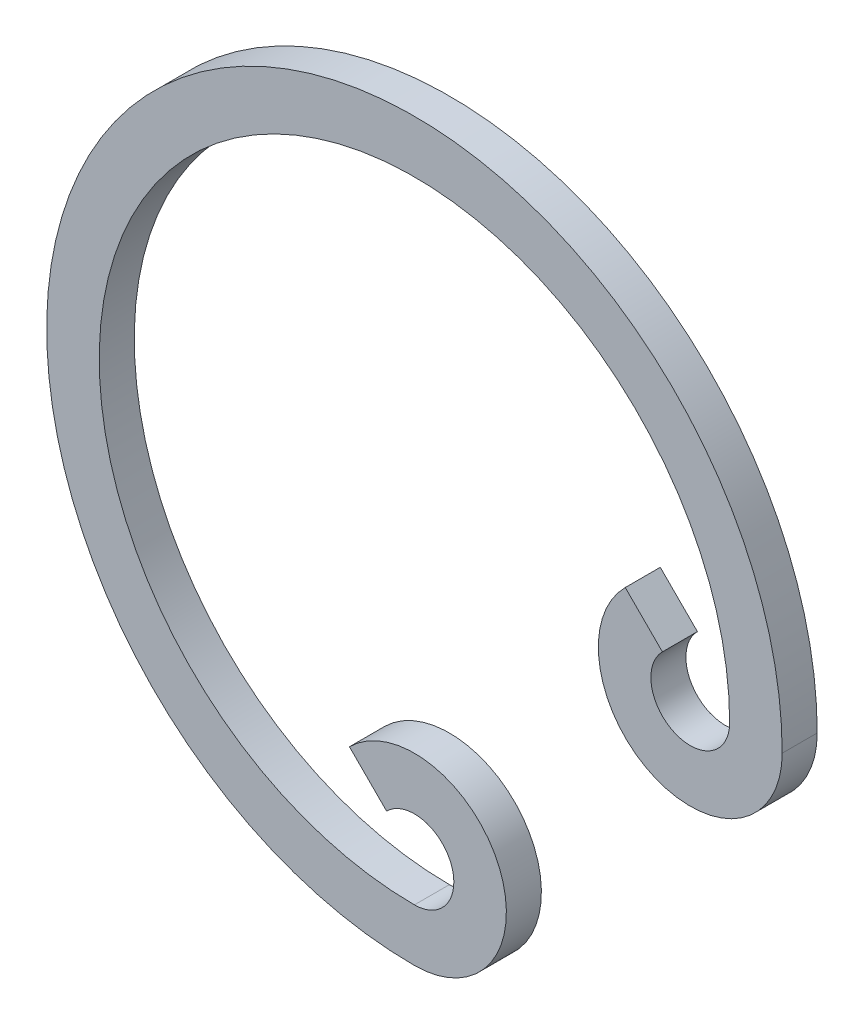
ISO-10303-21;
HEADER;
FILE_DESCRIPTION(('STEP AP214'),'2;1');
FILE_NAME('part.step','',(''),(''),'','','');
FILE_SCHEMA(('AUTOMOTIVE_DESIGN { 1 0 10303 214 1 1 1 1 }'));
ENDSEC;
DATA;
#1=APPLICATION_CONTEXT('core data for automotive mechanical design processes');
#2=APPLICATION_PROTOCOL_DEFINITION('international standard','automotive_design',2000,#1);
#3=PRODUCT_CONTEXT('',#1,'mechanical');
#4=PRODUCT('Part','Part','',(#3));
#5=PRODUCT_RELATED_PRODUCT_CATEGORY('part','',(#4));
#6=PRODUCT_DEFINITION_FORMATION('','',#4);
#7=PRODUCT_DEFINITION_CONTEXT('part definition',#1,'design');
#8=PRODUCT_DEFINITION('design','',#6,#7);
#9=PRODUCT_DEFINITION_SHAPE('','',#8);
#10=(LENGTH_UNIT() NAMED_UNIT(*) SI_UNIT(.MILLI.,.METRE.));
#11=(NAMED_UNIT(*) PLANE_ANGLE_UNIT() SI_UNIT($,.RADIAN.));
#12=(NAMED_UNIT(*) SI_UNIT($,.STERADIAN.) SOLID_ANGLE_UNIT());
#13=UNCERTAINTY_MEASURE_WITH_UNIT(LENGTH_MEASURE(1.E-05),#10,'distance_accuracy_value','');
#14=(GEOMETRIC_REPRESENTATION_CONTEXT(3) GLOBAL_UNCERTAINTY_ASSIGNED_CONTEXT((#13)) GLOBAL_UNIT_ASSIGNED_CONTEXT((#10,
#11,#12)) REPRESENTATION_CONTEXT('',''));
#15=CARTESIAN_POINT('',(0.,0.,0.));
#16=DIRECTION('',(0.,0.,1.));
#17=DIRECTION('',(1.,0.,0.));
#18=AXIS2_PLACEMENT_3D('',#15,#16,#17);
#19=CARTESIAN_POINT('',(0.,0.,1.));
#20=DIRECTION('',(0.,0.,-1.));
#21=DIRECTION('',(-1.,0.,0.));
#22=AXIS2_PLACEMENT_3D('',#19,#20,#21);
#23=CYLINDRICAL_SURFACE('',#22,10.5);
#24=CARTESIAN_POINT('',(0.,0.,0.));
#25=DIRECTION('',(0.,0.,1.));
#26=DIRECTION('',(1.,0.,0.));
#27=AXIS2_PLACEMENT_3D('',#24,#25,#26);
#28=CIRCLE('',#27,10.5);
#29=CARTESIAN_POINT('',(10.5,0.,0.));
#30=VERTEX_POINT('',#29);
#31=CARTESIAN_POINT('',(0.,-10.5,0.));
#32=VERTEX_POINT('',#31);
#33=EDGE_CURVE('E125',#30,#32,#28,.T.);
#34=ORIENTED_EDGE('',*,*,#33,.T.);
#35=DIRECTION('',(0.,0.,-1.));
#36=VECTOR('',#35,1.);
#37=CARTESIAN_POINT('',(0.,-10.5,1.));
#38=LINE('',#37,#36);
#39=CARTESIAN_POINT('',(0.,-10.5,1.));
#40=VERTEX_POINT('',#39);
#41=EDGE_CURVE('E11',#40,#32,#38,.T.);
#42=ORIENTED_EDGE('',*,*,#41,.F.);
#43=CARTESIAN_POINT('',(0.,0.,1.));
#44=DIRECTION('',(0.,0.,1.));
#45=DIRECTION('',(1.,0.,0.));
#46=AXIS2_PLACEMENT_3D('',#43,#44,#45);
#47=CIRCLE('',#46,10.5);
#48=CARTESIAN_POINT('',(10.5,0.,1.));
#49=VERTEX_POINT('',#48);
#50=EDGE_CURVE('E150',#49,#40,#47,.T.);
#51=ORIENTED_EDGE('',*,*,#50,.F.);
#52=DIRECTION('',(0.,0.,-1.));
#53=VECTOR('',#52,1.);
#54=CARTESIAN_POINT('',(10.5,0.,1.));
#55=LINE('',#54,#53);
#56=EDGE_CURVE('E140',#49,#30,#55,.T.);
#57=ORIENTED_EDGE('',*,*,#56,.T.);
#58=EDGE_LOOP('',(#34,#42,#51,#57));
#59=FACE_BOUND('',#58,.T.);
#60=ADVANCED_FACE('F34',(#59),#23,.T.);
#61=CARTESIAN_POINT('',(0.,-7.875,1.));
#62=DIRECTION('',(0.,0.,-1.));
#63=DIRECTION('',(-1.,0.,0.));
#64=AXIS2_PLACEMENT_3D('',#61,#62,#63);
#65=CYLINDRICAL_SURFACE('',#64,2.625);
#66=CARTESIAN_POINT('',(0.,-7.875,0.));
#67=DIRECTION('',(0.,0.,1.));
#68=DIRECTION('',(1.,0.,0.));
#69=AXIS2_PLACEMENT_3D('',#66,#67,#68);
#70=CIRCLE('',#69,2.625);
#71=CARTESIAN_POINT('',(-1.85615530061469,-6.01884469938531,0.));
#72=VERTEX_POINT('',#71);
#73=EDGE_CURVE('E158',#32,#72,#70,.T.);
#74=ORIENTED_EDGE('',*,*,#73,.T.);
#75=DIRECTION('',(0.,0.,-1.));
#76=VECTOR('',#75,1.);
#77=CARTESIAN_POINT('',(-1.85615530061469,-6.01884469938531,1.));
#78=LINE('',#77,#76);
#79=CARTESIAN_POINT('',(-1.85615530061469,-6.01884469938531,1.));
#80=VERTEX_POINT('',#79);
#81=EDGE_CURVE('E42',#80,#72,#78,.T.);
#82=ORIENTED_EDGE('',*,*,#81,.F.);
#83=CARTESIAN_POINT('',(0.,-7.875,1.));
#84=DIRECTION('',(0.,0.,1.));
#85=DIRECTION('',(1.,0.,0.));
#86=AXIS2_PLACEMENT_3D('',#83,#84,#85);
#87=CIRCLE('',#86,2.625);
#88=EDGE_CURVE('E81',#40,#80,#87,.T.);
#89=ORIENTED_EDGE('',*,*,#88,.F.);
#90=ORIENTED_EDGE('',*,*,#41,.T.);
#91=EDGE_LOOP('',(#74,#82,#89,#90));
#92=FACE_BOUND('',#91,.T.);
#93=ADVANCED_FACE('F187',(#92),#65,.T.);
#94=CARTESIAN_POINT('',(-0.795495128834863,-7.07950487116514,1.));
#95=DIRECTION('',(0.707106781186547,0.707106781186547,0.));
#96=DIRECTION('',(-0.707106781186548,0.707106781186548,0.));
#97=AXIS2_PLACEMENT_3D('',#94,#95,#96);
#98=PLANE('',#97);
#99=DIRECTION('',(0.707106781186547,-0.707106781186547,0.));
#100=VECTOR('',#99,1.);
#101=CARTESIAN_POINT('',(-0.795495128834863,-7.07950487116514,0.));
#102=LINE('',#101,#100);
#103=CARTESIAN_POINT('',(-0.795495128834862,-7.07950487116514,0.));
#104=VERTEX_POINT('',#103);
#105=EDGE_CURVE('E68',#72,#104,#102,.T.);
#106=ORIENTED_EDGE('',*,*,#105,.T.);
#107=DIRECTION('',(0.,0.,-1.));
#108=VECTOR('',#107,1.);
#109=CARTESIAN_POINT('',(-0.795495128834862,-7.07950487116514,1.));
#110=LINE('',#109,#108);
#111=CARTESIAN_POINT('',(-0.795495128834862,-7.07950487116514,1.));
#112=VERTEX_POINT('',#111);
#113=EDGE_CURVE('E164',#112,#104,#110,.T.);
#114=ORIENTED_EDGE('',*,*,#113,.F.);
#115=DIRECTION('',(0.707106781186547,-0.707106781186547,0.));
#116=VECTOR('',#115,1.);
#117=CARTESIAN_POINT('',(-0.795495128834863,-7.07950487116514,1.));
#118=LINE('',#117,#116);
#119=EDGE_CURVE('E153',#80,#112,#118,.T.);
#120=ORIENTED_EDGE('',*,*,#119,.F.);
#121=ORIENTED_EDGE('',*,*,#81,.T.);
#122=EDGE_LOOP('',(#106,#114,#120,#121));
#123=FACE_BOUND('',#122,.T.);
#124=ADVANCED_FACE('F166',(#123),#98,.F.);
#125=CARTESIAN_POINT('',(0.,-7.875,1.));
#126=DIRECTION('',(0.,0.,-1.));
#127=DIRECTION('',(-1.,0.,0.));
#128=AXIS2_PLACEMENT_3D('',#125,#126,#127);
#129=CYLINDRICAL_SURFACE('',#128,1.125);
#130=CARTESIAN_POINT('',(0.,-7.875,0.));
#131=DIRECTION('',(0.,0.,-1.));
#132=DIRECTION('',(1.,0.,0.));
#133=AXIS2_PLACEMENT_3D('',#130,#131,#132);
#134=CIRCLE('',#133,1.125);
#135=CARTESIAN_POINT('',(0.,-9.,0.));
#136=VERTEX_POINT('',#135);
#137=EDGE_CURVE('E74',#104,#136,#134,.T.);
#138=ORIENTED_EDGE('',*,*,#137,.T.);
#139=DIRECTION('',(0.,0.,-1.));
#140=VECTOR('',#139,1.);
#141=CARTESIAN_POINT('',(0.,-9.,1.));
#142=LINE('',#141,#140);
#143=CARTESIAN_POINT('',(0.,-9.,1.));
#144=VERTEX_POINT('',#143);
#145=EDGE_CURVE('E115',#144,#136,#142,.T.);
#146=ORIENTED_EDGE('',*,*,#145,.F.);
#147=CARTESIAN_POINT('',(0.,-7.875,1.));
#148=DIRECTION('',(0.,0.,-1.));
#149=DIRECTION('',(1.,0.,0.));
#150=AXIS2_PLACEMENT_3D('',#147,#148,#149);
#151=CIRCLE('',#150,1.125);
#152=EDGE_CURVE('E50',#112,#144,#151,.T.);
#153=ORIENTED_EDGE('',*,*,#152,.F.);
#154=ORIENTED_EDGE('',*,*,#113,.T.);
#155=EDGE_LOOP('',(#138,#146,#153,#154));
#156=FACE_BOUND('',#155,.T.);
#157=ADVANCED_FACE('F179',(#156),#129,.F.);
#158=CARTESIAN_POINT('',(0.,0.,1.));
#159=DIRECTION('',(0.,0.,-1.));
#160=DIRECTION('',(-1.,0.,0.));
#161=AXIS2_PLACEMENT_3D('',#158,#159,#160);
#162=CYLINDRICAL_SURFACE('',#161,9.);
#163=CARTESIAN_POINT('',(0.,0.,0.));
#164=DIRECTION('',(0.,0.,-1.));
#165=DIRECTION('',(1.,0.,0.));
#166=AXIS2_PLACEMENT_3D('',#163,#164,#165);
#167=CIRCLE('',#166,9.);
#168=CARTESIAN_POINT('',(9.,0.,0.));
#169=VERTEX_POINT('',#168);
#170=EDGE_CURVE('E121',#136,#169,#167,.T.);
#171=ORIENTED_EDGE('',*,*,#170,.T.);
#172=DIRECTION('',(0.,0.,-1.));
#173=VECTOR('',#172,1.);
#174=CARTESIAN_POINT('',(9.,0.,1.));
#175=LINE('',#174,#173);
#176=CARTESIAN_POINT('',(9.,0.,1.));
#177=VERTEX_POINT('',#176);
#178=EDGE_CURVE('E118',#177,#169,#175,.T.);
#179=ORIENTED_EDGE('',*,*,#178,.F.);
#180=CARTESIAN_POINT('',(0.,0.,1.));
#181=DIRECTION('',(0.,0.,-1.));
#182=DIRECTION('',(1.,0.,0.));
#183=AXIS2_PLACEMENT_3D('',#180,#181,#182);
#184=CIRCLE('',#183,9.);
#185=EDGE_CURVE('E107',#144,#177,#184,.T.);
#186=ORIENTED_EDGE('',*,*,#185,.F.);
#187=ORIENTED_EDGE('',*,*,#145,.T.);
#188=EDGE_LOOP('',(#171,#179,#186,#187));
#189=FACE_BOUND('',#188,.T.);
#190=ADVANCED_FACE('F119',(#189),#162,.F.);
#191=CARTESIAN_POINT('',(0.,0.,1.));
#192=DIRECTION('',(0.,0.,1.));
#193=DIRECTION('',(1.,0.,0.));
#194=AXIS2_PLACEMENT_3D('',#191,#192,#193);
#195=PLANE('',#194);
#196=ORIENTED_EDGE('',*,*,#50,.T.);
#197=ORIENTED_EDGE('',*,*,#88,.T.);
#198=ORIENTED_EDGE('',*,*,#119,.T.);
#199=ORIENTED_EDGE('',*,*,#152,.T.);
#200=ORIENTED_EDGE('',*,*,#185,.T.);
#201=CARTESIAN_POINT('',(7.875,0.,1.));
#202=DIRECTION('',(0.,0.,1.));
#203=DIRECTION('',(0.,-1.,0.));
#204=AXIS2_PLACEMENT_3D('',#201,#202,#203);
#205=CIRCLE('',#204,1.125);
#206=CARTESIAN_POINT('',(7.07950487116514,0.795495128834867,1.));
#207=VERTEX_POINT('',#206);
#208=EDGE_CURVE('E112',#207,#177,#205,.T.);
#209=ORIENTED_EDGE('',*,*,#208,.F.);
#210=DIRECTION('',(0.707106781186548,-0.707106781186547,0.));
#211=VECTOR('',#210,1.);
#212=CARTESIAN_POINT('',(7.07950487116514,0.795495128834868,1.));
#213=LINE('',#212,#211);
#214=CARTESIAN_POINT('',(6.01884469938531,1.85615530061469,1.));
#215=VERTEX_POINT('',#214);
#216=EDGE_CURVE('E129',#215,#207,#213,.T.);
#217=ORIENTED_EDGE('',*,*,#216,.F.);
#218=CARTESIAN_POINT('',(7.875,0.,1.));
#219=DIRECTION('',(0.,0.,-1.));
#220=DIRECTION('',(0.,-1.,0.));
#221=AXIS2_PLACEMENT_3D('',#218,#219,#220);
#222=CIRCLE('',#221,2.625);
#223=EDGE_CURVE('E132',#49,#215,#222,.T.);
#224=ORIENTED_EDGE('',*,*,#223,.F.);
#225=EDGE_LOOP('',(#196,#197,#198,#199,#200,#209,#217,#224));
#226=FACE_BOUND('',#225,.T.);
#227=ADVANCED_FACE('F109',(#226),#195,.T.);
#228=CARTESIAN_POINT('',(0.,0.,0.));
#229=DIRECTION('',(0.,0.,1.));
#230=DIRECTION('',(1.,0.,0.));
#231=AXIS2_PLACEMENT_3D('',#228,#229,#230);
#232=PLANE('',#231);
#233=ORIENTED_EDGE('',*,*,#33,.F.);
#234=CARTESIAN_POINT('',(7.875,0.,0.));
#235=DIRECTION('',(0.,0.,-1.));
#236=DIRECTION('',(0.,-1.,0.));
#237=AXIS2_PLACEMENT_3D('',#234,#235,#236);
#238=CIRCLE('',#237,2.625);
#239=CARTESIAN_POINT('',(6.01884469938531,1.85615530061469,0.));
#240=VERTEX_POINT('',#239);
#241=EDGE_CURVE('E130',#30,#240,#238,.T.);
#242=ORIENTED_EDGE('',*,*,#241,.T.);
#243=DIRECTION('',(0.707106781186548,-0.707106781186547,0.));
#244=VECTOR('',#243,1.);
#245=CARTESIAN_POINT('',(7.07950487116514,0.795495128834868,0.));
#246=LINE('',#245,#244);
#247=CARTESIAN_POINT('',(7.07950487116514,0.795495128834867,0.));
#248=VERTEX_POINT('',#247);
#249=EDGE_CURVE('E135',#240,#248,#246,.T.);
#250=ORIENTED_EDGE('',*,*,#249,.T.);
#251=CARTESIAN_POINT('',(7.875,0.,0.));
#252=DIRECTION('',(0.,0.,1.));
#253=DIRECTION('',(0.,-1.,0.));
#254=AXIS2_PLACEMENT_3D('',#251,#252,#253);
#255=CIRCLE('',#254,1.125);
#256=EDGE_CURVE('E141',#248,#169,#255,.T.);
#257=ORIENTED_EDGE('',*,*,#256,.T.);
#258=ORIENTED_EDGE('',*,*,#170,.F.);
#259=ORIENTED_EDGE('',*,*,#137,.F.);
#260=ORIENTED_EDGE('',*,*,#105,.F.);
#261=ORIENTED_EDGE('',*,*,#73,.F.);
#262=EDGE_LOOP('',(#233,#242,#250,#257,#258,#259,#260,#261));
#263=FACE_BOUND('',#262,.T.);
#264=ADVANCED_FACE('F168',(#263),#232,.F.);
#265=CARTESIAN_POINT('',(7.875,0.,1.));
#266=DIRECTION('',(0.,0.,-1.));
#267=DIRECTION('',(-1.,0.,0.));
#268=AXIS2_PLACEMENT_3D('',#265,#266,#267);
#269=CYLINDRICAL_SURFACE('',#268,1.125);
#270=ORIENTED_EDGE('',*,*,#256,.F.);
#271=DIRECTION('',(0.,0.,-1.));
#272=VECTOR('',#271,1.);
#273=CARTESIAN_POINT('',(7.07950487116514,0.795495128834867,1.));
#274=LINE('',#273,#272);
#275=EDGE_CURVE('E126',#207,#248,#274,.T.);
#276=ORIENTED_EDGE('',*,*,#275,.F.);
#277=ORIENTED_EDGE('',*,*,#208,.T.);
#278=ORIENTED_EDGE('',*,*,#178,.T.);
#279=EDGE_LOOP('',(#270,#276,#277,#278));
#280=FACE_BOUND('',#279,.T.);
#281=ADVANCED_FACE('F128',(#280),#269,.F.);
#282=CARTESIAN_POINT('',(7.07950487116514,0.795495128834868,1.));
#283=DIRECTION('',(0.707106781186547,0.707106781186548,0.));
#284=DIRECTION('',(-0.707106781186548,0.707106781186547,0.));
#285=AXIS2_PLACEMENT_3D('',#282,#283,#284);
#286=PLANE('',#285);
#287=ORIENTED_EDGE('',*,*,#249,.F.);
#288=DIRECTION('',(0.,0.,-1.));
#289=VECTOR('',#288,1.);
#290=CARTESIAN_POINT('',(6.01884469938531,1.85615530061469,1.));
#291=LINE('',#290,#289);
#292=EDGE_CURVE('E147',#215,#240,#291,.T.);
#293=ORIENTED_EDGE('',*,*,#292,.F.);
#294=ORIENTED_EDGE('',*,*,#216,.T.);
#295=ORIENTED_EDGE('',*,*,#275,.T.);
#296=EDGE_LOOP('',(#287,#293,#294,#295));
#297=FACE_BOUND('',#296,.T.);
#298=ADVANCED_FACE('F172',(#297),#286,.T.);
#299=CARTESIAN_POINT('',(7.875,0.,1.));
#300=DIRECTION('',(0.,0.,-1.));
#301=DIRECTION('',(-1.,0.,0.));
#302=AXIS2_PLACEMENT_3D('',#299,#300,#301);
#303=CYLINDRICAL_SURFACE('',#302,2.625);
#304=ORIENTED_EDGE('',*,*,#241,.F.);
#305=ORIENTED_EDGE('',*,*,#56,.F.);
#306=ORIENTED_EDGE('',*,*,#223,.T.);
#307=ORIENTED_EDGE('',*,*,#292,.T.);
#308=EDGE_LOOP('',(#304,#305,#306,#307));
#309=FACE_BOUND('',#308,.T.);
#310=ADVANCED_FACE('F176',(#309),#303,.T.);
#311=CLOSED_SHELL('',(#60,#93,#124,#157,#190,#227,#264,#281,#298,#310));
#312=MANIFOLD_SOLID_BREP('B2',#311);
#313=ADVANCED_BREP_SHAPE_REPRESENTATION('',(#18,#312),#14);
#314=SHAPE_DEFINITION_REPRESENTATION(#9,#313);
ENDSEC;
END-ISO-10303-21;
